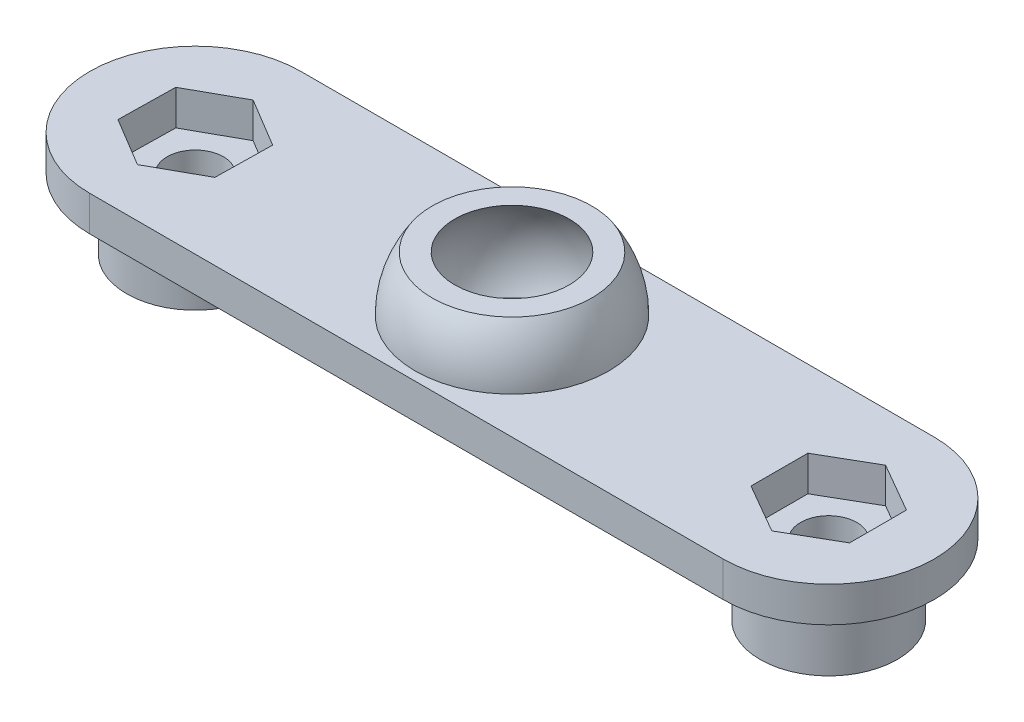
ISO-10303-21;
HEADER;
FILE_DESCRIPTION(('STEP AP214'),'2;1');
FILE_NAME('part.step','',(''),(''),'','','');
FILE_SCHEMA(('AUTOMOTIVE_DESIGN { 1 0 10303 214 1 1 1 1 }'));
ENDSEC;
DATA;
#1=APPLICATION_CONTEXT('core data for automotive mechanical design processes');
#2=APPLICATION_PROTOCOL_DEFINITION('international standard','automotive_design',2000,#1);
#3=PRODUCT_CONTEXT('',#1,'mechanical');
#4=PRODUCT('Part','Part','',(#3));
#5=PRODUCT_RELATED_PRODUCT_CATEGORY('part','',(#4));
#6=PRODUCT_DEFINITION_FORMATION('','',#4);
#7=PRODUCT_DEFINITION_CONTEXT('part definition',#1,'design');
#8=PRODUCT_DEFINITION('design','',#6,#7);
#9=PRODUCT_DEFINITION_SHAPE('','',#8);
#10=(LENGTH_UNIT() NAMED_UNIT(*) SI_UNIT(.MILLI.,.METRE.));
#11=(NAMED_UNIT(*) PLANE_ANGLE_UNIT() SI_UNIT($,.RADIAN.));
#12=(NAMED_UNIT(*) SI_UNIT($,.STERADIAN.) SOLID_ANGLE_UNIT());
#13=UNCERTAINTY_MEASURE_WITH_UNIT(LENGTH_MEASURE(1.E-05),#10,'distance_accuracy_value','');
#14=(GEOMETRIC_REPRESENTATION_CONTEXT(3) GLOBAL_UNCERTAINTY_ASSIGNED_CONTEXT((#13)) GLOBAL_UNIT_ASSIGNED_CONTEXT((#10,
#11,#12)) REPRESENTATION_CONTEXT('',''));
#15=CARTESIAN_POINT('',(0.,0.,0.));
#16=DIRECTION('',(0.,0.,1.));
#17=DIRECTION('',(1.,0.,0.));
#18=AXIS2_PLACEMENT_3D('',#15,#16,#17);
#19=CARTESIAN_POINT('',(18.,2.,0.));
#20=DIRECTION('',(0.,-1.,0.));
#21=DIRECTION('',(0.,0.,-1.));
#22=AXIS2_PLACEMENT_3D('',#19,#20,#21);
#23=CYLINDRICAL_SURFACE('',#22,1.6);
#24=CARTESIAN_POINT('',(18.,-4.,0.));
#25=DIRECTION('',(0.,-1.,0.));
#26=DIRECTION('',(0.,0.,-1.));
#27=AXIS2_PLACEMENT_3D('',#24,#25,#26);
#28=CIRCLE('',#27,1.6);
#29=CARTESIAN_POINT('',(18.,-4.,-1.6));
#30=VERTEX_POINT('',#29);
#31=EDGE_CURVE('E257',#30,#30,#28,.T.);
#32=ORIENTED_EDGE('',*,*,#31,.T.);
#33=EDGE_LOOP('',(#32));
#34=FACE_BOUND('',#33,.T.);
#35=CARTESIAN_POINT('',(18.,0.,0.));
#36=DIRECTION('',(0.,1.,0.));
#37=DIRECTION('',(0.,0.,1.));
#38=AXIS2_PLACEMENT_3D('',#35,#36,#37);
#39=CIRCLE('',#38,1.6);
#40=CARTESIAN_POINT('',(18.,0.,1.6));
#41=VERTEX_POINT('',#40);
#42=EDGE_CURVE('E36',#41,#41,#39,.T.);
#43=ORIENTED_EDGE('',*,*,#42,.T.);
#44=EDGE_LOOP('',(#43));
#45=FACE_BOUND('',#44,.T.);
#46=ADVANCED_FACE('F32',(#34,#45),#23,.F.);
#47=CARTESIAN_POINT('',(-18.,2.,0.));
#48=DIRECTION('',(0.,-1.,0.));
#49=DIRECTION('',(0.,0.,-1.));
#50=AXIS2_PLACEMENT_3D('',#47,#48,#49);
#51=CYLINDRICAL_SURFACE('',#50,1.6);
#52=CARTESIAN_POINT('',(-18.,-4.,0.));
#53=DIRECTION('',(0.,-1.,0.));
#54=DIRECTION('',(0.,0.,-1.));
#55=AXIS2_PLACEMENT_3D('',#52,#53,#54);
#56=CIRCLE('',#55,1.6);
#57=CARTESIAN_POINT('',(-18.,-4.,-1.6));
#58=VERTEX_POINT('',#57);
#59=EDGE_CURVE('E263',#58,#58,#56,.T.);
#60=ORIENTED_EDGE('',*,*,#59,.T.);
#61=EDGE_LOOP('',(#60));
#62=FACE_BOUND('',#61,.T.);
#63=CARTESIAN_POINT('',(-18.,0.,0.));
#64=DIRECTION('',(0.,1.,0.));
#65=DIRECTION('',(0.,0.,1.));
#66=AXIS2_PLACEMENT_3D('',#63,#64,#65);
#67=CIRCLE('',#66,1.6);
#68=CARTESIAN_POINT('',(-18.,0.,1.6));
#69=VERTEX_POINT('',#68);
#70=EDGE_CURVE('E238',#69,#69,#67,.T.);
#71=ORIENTED_EDGE('',*,*,#70,.T.);
#72=EDGE_LOOP('',(#71));
#73=FACE_BOUND('',#72,.T.);
#74=ADVANCED_FACE('F306',(#62,#73),#51,.F.);
#75=CARTESIAN_POINT('',(-18.,0.,0.));
#76=DIRECTION('',(0.,1.,0.));
#77=DIRECTION('',(0.,0.,1.));
#78=AXIS2_PLACEMENT_3D('',#75,#76,#77);
#79=PLANE('',#78);
#80=CARTESIAN_POINT('',(-18.,0.,0.));
#81=DIRECTION('',(0.,1.,0.));
#82=DIRECTION('',(0.,0.,1.));
#83=AXIS2_PLACEMENT_3D('',#80,#81,#82);
#84=CIRCLE('',#83,3.9);
#85=CARTESIAN_POINT('',(-18.,0.,3.9));
#86=VERTEX_POINT('',#85);
#87=EDGE_CURVE('E299',#86,#86,#84,.F.);
#88=ORIENTED_EDGE('',*,*,#87,.F.);
#89=EDGE_LOOP('',(#88));
#90=FACE_BOUND('',#89,.T.);
#91=CARTESIAN_POINT('',(-18.,0.,0.));
#92=DIRECTION('',(0.,1.,0.));
#93=DIRECTION('',(0.,0.,1.));
#94=AXIS2_PLACEMENT_3D('',#91,#92,#93);
#95=CIRCLE('',#94,6.);
#96=CARTESIAN_POINT('',(-18.,0.,-6.));
#97=VERTEX_POINT('',#96);
#98=CARTESIAN_POINT('',(-18.,0.,6.));
#99=VERTEX_POINT('',#98);
#100=EDGE_CURVE('E269',#97,#99,#95,.T.);
#101=ORIENTED_EDGE('',*,*,#100,.F.);
#102=DIRECTION('',(-1.,0.,0.));
#103=VECTOR('',#102,1.);
#104=CARTESIAN_POINT('',(-18.,0.,-6.));
#105=LINE('',#104,#103);
#106=CARTESIAN_POINT('',(18.,0.,-6.));
#107=VERTEX_POINT('',#106);
#108=EDGE_CURVE('E274',#107,#97,#105,.T.);
#109=ORIENTED_EDGE('',*,*,#108,.F.);
#110=CARTESIAN_POINT('',(18.,0.,0.));
#111=DIRECTION('',(0.,1.,0.));
#112=DIRECTION('',(0.,0.,1.));
#113=AXIS2_PLACEMENT_3D('',#110,#111,#112);
#114=CIRCLE('',#113,6.);
#115=CARTESIAN_POINT('',(18.,0.,6.));
#116=VERTEX_POINT('',#115);
#117=EDGE_CURVE('E285',#116,#107,#114,.T.);
#118=ORIENTED_EDGE('',*,*,#117,.F.);
#119=DIRECTION('',(1.,0.,0.));
#120=VECTOR('',#119,1.);
#121=CARTESIAN_POINT('',(-18.,0.,6.));
#122=LINE('',#121,#120);
#123=EDGE_CURVE('E283',#99,#116,#122,.T.);
#124=ORIENTED_EDGE('',*,*,#123,.F.);
#125=EDGE_LOOP('',(#101,#109,#118,#124));
#126=FACE_BOUND('',#125,.T.);
#127=CARTESIAN_POINT('',(18.,0.,0.));
#128=DIRECTION('',(0.,1.,0.));
#129=DIRECTION('',(0.,0.,1.));
#130=AXIS2_PLACEMENT_3D('',#127,#128,#129);
#131=CIRCLE('',#130,3.9);
#132=CARTESIAN_POINT('',(18.,0.,3.9));
#133=VERTEX_POINT('',#132);
#134=EDGE_CURVE('E41',#133,#133,#131,.F.);
#135=ORIENTED_EDGE('',*,*,#134,.F.);
#136=EDGE_LOOP('',(#135));
#137=FACE_BOUND('',#136,.T.);
#138=CARTESIAN_POINT('',(0.,0.,0.));
#139=DIRECTION('',(0.,1.,0.));
#140=DIRECTION('',(0.,0.,1.));
#141=AXIS2_PLACEMENT_3D('',#138,#139,#140);
#142=CIRCLE('',#141,4.03112887414927);
#143=CARTESIAN_POINT('',(0.,0.,4.03112887414927));
#144=VERTEX_POINT('',#143);
#145=EDGE_CURVE('E248',#144,#144,#142,.T.);
#146=ORIENTED_EDGE('',*,*,#145,.T.);
#147=EDGE_LOOP('',(#146));
#148=FACE_BOUND('',#147,.T.);
#149=ADVANCED_FACE('F338',(#90,#126,#137,#148),#79,.F.);
#150=CARTESIAN_POINT('',(-18.,2.,0.));
#151=DIRECTION('',(0.,1.,0.));
#152=DIRECTION('',(0.,0.,1.));
#153=AXIS2_PLACEMENT_3D('',#150,#151,#152);
#154=PLANE('',#153);
#155=DIRECTION('',(0.866025403784438,0.,0.5));
#156=VECTOR('',#155,1.);
#157=CARTESIAN_POINT('',(15.2,2.,1.61658075373095));
#158=LINE('',#157,#156);
#159=CARTESIAN_POINT('',(15.2,2.,1.61658075373095));
#160=VERTEX_POINT('',#159);
#161=CARTESIAN_POINT('',(18.,2.,3.2331615074619));
#162=VERTEX_POINT('',#161);
#163=EDGE_CURVE('E49',#160,#162,#158,.T.);
#164=ORIENTED_EDGE('',*,*,#163,.F.);
#165=DIRECTION('',(0.,0.,1.));
#166=VECTOR('',#165,1.);
#167=CARTESIAN_POINT('',(15.2,2.,-1.61658075373095));
#168=LINE('',#167,#166);
#169=CARTESIAN_POINT('',(15.2,2.,-1.61658075373095));
#170=VERTEX_POINT('',#169);
#171=EDGE_CURVE('E168',#170,#160,#168,.T.);
#172=ORIENTED_EDGE('',*,*,#171,.F.);
#173=DIRECTION('',(-0.866025403784439,0.,0.5));
#174=VECTOR('',#173,1.);
#175=CARTESIAN_POINT('',(18.,2.,-3.23316150746191));
#176=LINE('',#175,#174);
#177=CARTESIAN_POINT('',(18.,2.,-3.23316150746191));
#178=VERTEX_POINT('',#177);
#179=EDGE_CURVE('E171',#178,#170,#176,.T.);
#180=ORIENTED_EDGE('',*,*,#179,.F.);
#181=DIRECTION('',(-0.866025403784439,0.,-0.5));
#182=VECTOR('',#181,1.);
#183=CARTESIAN_POINT('',(20.8,2.,-1.61658075373095));
#184=LINE('',#183,#182);
#185=CARTESIAN_POINT('',(20.8,2.,-1.61658075373095));
#186=VERTEX_POINT('',#185);
#187=EDGE_CURVE('E187',#186,#178,#184,.T.);
#188=ORIENTED_EDGE('',*,*,#187,.F.);
#189=DIRECTION('',(0.,0.,-1.));
#190=VECTOR('',#189,1.);
#191=CARTESIAN_POINT('',(20.8,2.,1.61658075373095));
#192=LINE('',#191,#190);
#193=CARTESIAN_POINT('',(20.8,2.,1.61658075373095));
#194=VERTEX_POINT('',#193);
#195=EDGE_CURVE('E184',#194,#186,#192,.T.);
#196=ORIENTED_EDGE('',*,*,#195,.F.);
#197=DIRECTION('',(0.866025403784438,0.,-0.5));
#198=VECTOR('',#197,1.);
#199=CARTESIAN_POINT('',(18.,2.,3.2331615074619));
#200=LINE('',#199,#198);
#201=EDGE_CURVE('E182',#162,#194,#200,.T.);
#202=ORIENTED_EDGE('',*,*,#201,.F.);
#203=EDGE_LOOP('',(#164,#172,#180,#188,#196,#202));
#204=FACE_BOUND('',#203,.T.);
#205=DIRECTION('',(0.874174864633743,0.,-0.48561127050613));
#206=VECTOR('',#205,1.);
#207=CARTESIAN_POINT('',(-18.0534627041451,2.,3.23271945466953));
#208=LINE('',#207,#206);
#209=CARTESIAN_POINT('',(-18.0534627041451,2.,3.23271945466953));
#210=VERTEX_POINT('',#209);
#211=CARTESIAN_POINT('',(-15.2271141810206,2.,1.66265978727944));
#212=VERTEX_POINT('',#211);
#213=EDGE_CURVE('E57',#210,#212,#208,.T.);
#214=ORIENTED_EDGE('',*,*,#213,.F.);
#215=DIRECTION('',(0.857639128939217,0.,0.514252004869579));
#216=VECTOR('',#215,1.);
#217=CARTESIAN_POINT('',(-20.8263485231245,2.,1.57005966739009));
#218=LINE('',#217,#216);
#219=CARTESIAN_POINT('',(-20.8263485231245,2.,1.57005966739009));
#220=VERTEX_POINT('',#219);
#221=EDGE_CURVE('E205',#220,#210,#218,.T.);
#222=ORIENTED_EDGE('',*,*,#221,.F.);
#223=DIRECTION('',(-0.0165357356945256,0.,0.999863275375709));
#224=VECTOR('',#223,1.);
#225=CARTESIAN_POINT('',(-20.7728858189794,2.,-1.66265978727944));
#226=LINE('',#225,#224);
#227=CARTESIAN_POINT('',(-20.7728858189794,2.,-1.66265978727944));
#228=VERTEX_POINT('',#227);
#229=EDGE_CURVE('E231',#228,#220,#226,.T.);
#230=ORIENTED_EDGE('',*,*,#229,.F.);
#231=DIRECTION('',(-0.874174864633743,0.,0.48561127050613));
#232=VECTOR('',#231,1.);
#233=CARTESIAN_POINT('',(-17.9465372958549,2.,-3.23271945466953));
#234=LINE('',#233,#232);
#235=CARTESIAN_POINT('',(-17.9465372958549,2.,-3.23271945466953));
#236=VERTEX_POINT('',#235);
#237=EDGE_CURVE('E228',#236,#228,#234,.T.);
#238=ORIENTED_EDGE('',*,*,#237,.F.);
#239=DIRECTION('',(-0.857639128939217,0.,-0.514252004869579));
#240=VECTOR('',#239,1.);
#241=CARTESIAN_POINT('',(-15.1736514768755,2.,-1.57005966739009));
#242=LINE('',#241,#240);
#243=CARTESIAN_POINT('',(-15.1736514768755,2.,-1.57005966739009));
#244=VERTEX_POINT('',#243);
#245=EDGE_CURVE('E225',#244,#236,#242,.T.);
#246=ORIENTED_EDGE('',*,*,#245,.F.);
#247=DIRECTION('',(0.0165357356945256,0.,-0.999863275375709));
#248=VECTOR('',#247,1.);
#249=CARTESIAN_POINT('',(-15.2271141810206,2.,1.66265978727944));
#250=LINE('',#249,#248);
#251=EDGE_CURVE('E222',#212,#244,#250,.T.);
#252=ORIENTED_EDGE('',*,*,#251,.F.);
#253=EDGE_LOOP('',(#214,#222,#230,#238,#246,#252));
#254=FACE_BOUND('',#253,.T.);
#255=CARTESIAN_POINT('',(0.,2.,0.));
#256=DIRECTION('',(0.,1.,0.));
#257=DIRECTION('',(0.,0.,1.));
#258=AXIS2_PLACEMENT_3D('',#255,#256,#257);
#259=CIRCLE('',#258,5.5);
#260=CARTESIAN_POINT('',(0.,2.,5.5));
#261=VERTEX_POINT('',#260);
#262=EDGE_CURVE('E11',#261,#261,#259,.T.);
#263=ORIENTED_EDGE('',*,*,#262,.F.);
#264=EDGE_LOOP('',(#263));
#265=FACE_BOUND('',#264,.T.);
#266=CARTESIAN_POINT('',(-18.,2.,0.));
#267=DIRECTION('',(0.,1.,0.));
#268=DIRECTION('',(0.,0.,1.));
#269=AXIS2_PLACEMENT_3D('',#266,#267,#268);
#270=CIRCLE('',#269,6.);
#271=CARTESIAN_POINT('',(-18.,2.,-6.));
#272=VERTEX_POINT('',#271);
#273=CARTESIAN_POINT('',(-18.,2.,6.));
#274=VERTEX_POINT('',#273);
#275=EDGE_CURVE('E270',#272,#274,#270,.T.);
#276=ORIENTED_EDGE('',*,*,#275,.T.);
#277=DIRECTION('',(1.,0.,0.));
#278=VECTOR('',#277,1.);
#279=CARTESIAN_POINT('',(-18.,2.,6.));
#280=LINE('',#279,#278);
#281=CARTESIAN_POINT('',(18.,2.,6.));
#282=VERTEX_POINT('',#281);
#283=EDGE_CURVE('E273',#274,#282,#280,.T.);
#284=ORIENTED_EDGE('',*,*,#283,.T.);
#285=CARTESIAN_POINT('',(18.,2.,0.));
#286=DIRECTION('',(0.,1.,0.));
#287=DIRECTION('',(0.,0.,1.));
#288=AXIS2_PLACEMENT_3D('',#285,#286,#287);
#289=CIRCLE('',#288,6.);
#290=CARTESIAN_POINT('',(18.,2.,-6.));
#291=VERTEX_POINT('',#290);
#292=EDGE_CURVE('E276',#282,#291,#289,.T.);
#293=ORIENTED_EDGE('',*,*,#292,.T.);
#294=DIRECTION('',(-1.,0.,0.));
#295=VECTOR('',#294,1.);
#296=CARTESIAN_POINT('',(-18.,2.,-6.));
#297=LINE('',#296,#295);
#298=EDGE_CURVE('E278',#291,#272,#297,.T.);
#299=ORIENTED_EDGE('',*,*,#298,.T.);
#300=EDGE_LOOP('',(#276,#284,#293,#299));
#301=FACE_BOUND('',#300,.T.);
#302=ADVANCED_FACE('F335',(#204,#254,#265,#301),#154,.T.);
#303=CARTESIAN_POINT('',(-18.,2.,0.));
#304=DIRECTION('',(0.,-1.,0.));
#305=DIRECTION('',(0.,0.,-1.));
#306=AXIS2_PLACEMENT_3D('',#303,#304,#305);
#307=CYLINDRICAL_SURFACE('',#306,6.);
#308=ORIENTED_EDGE('',*,*,#100,.T.);
#309=DIRECTION('',(0.,-1.,0.));
#310=VECTOR('',#309,1.);
#311=CARTESIAN_POINT('',(-18.,2.,6.));
#312=LINE('',#311,#310);
#313=EDGE_CURVE('E296',#274,#99,#312,.T.);
#314=ORIENTED_EDGE('',*,*,#313,.F.);
#315=ORIENTED_EDGE('',*,*,#275,.F.);
#316=DIRECTION('',(0.,-1.,0.));
#317=VECTOR('',#316,1.);
#318=CARTESIAN_POINT('',(-18.,2.,-6.));
#319=LINE('',#318,#317);
#320=EDGE_CURVE('E280',#272,#97,#319,.T.);
#321=ORIENTED_EDGE('',*,*,#320,.T.);
#322=EDGE_LOOP('',(#308,#314,#315,#321));
#323=FACE_BOUND('',#322,.T.);
#324=ADVANCED_FACE('F34',(#323),#307,.T.);
#325=CARTESIAN_POINT('',(-18.,2.,6.));
#326=DIRECTION('',(0.,0.,-1.));
#327=DIRECTION('',(-1.,0.,0.));
#328=AXIS2_PLACEMENT_3D('',#325,#326,#327);
#329=PLANE('',#328);
#330=ORIENTED_EDGE('',*,*,#123,.T.);
#331=DIRECTION('',(0.,-1.,0.));
#332=VECTOR('',#331,1.);
#333=CARTESIAN_POINT('',(18.,2.,6.));
#334=LINE('',#333,#332);
#335=EDGE_CURVE('E293',#282,#116,#334,.T.);
#336=ORIENTED_EDGE('',*,*,#335,.F.);
#337=ORIENTED_EDGE('',*,*,#283,.F.);
#338=ORIENTED_EDGE('',*,*,#313,.T.);
#339=EDGE_LOOP('',(#330,#336,#337,#338));
#340=FACE_BOUND('',#339,.T.);
#341=ADVANCED_FACE('F351',(#340),#329,.F.);
#342=CARTESIAN_POINT('',(18.,2.,0.));
#343=DIRECTION('',(0.,-1.,0.));
#344=DIRECTION('',(0.,0.,-1.));
#345=AXIS2_PLACEMENT_3D('',#342,#343,#344);
#346=CYLINDRICAL_SURFACE('',#345,6.);
#347=ORIENTED_EDGE('',*,*,#117,.T.);
#348=DIRECTION('',(0.,-1.,0.));
#349=VECTOR('',#348,1.);
#350=CARTESIAN_POINT('',(18.,2.,-6.));
#351=LINE('',#350,#349);
#352=EDGE_CURVE('E290',#291,#107,#351,.T.);
#353=ORIENTED_EDGE('',*,*,#352,.F.);
#354=ORIENTED_EDGE('',*,*,#292,.F.);
#355=ORIENTED_EDGE('',*,*,#335,.T.);
#356=EDGE_LOOP('',(#347,#353,#354,#355));
#357=FACE_BOUND('',#356,.T.);
#358=ADVANCED_FACE('F356',(#357),#346,.T.);
#359=CARTESIAN_POINT('',(-18.,2.,-6.));
#360=DIRECTION('',(0.,0.,1.));
#361=DIRECTION('',(1.,0.,0.));
#362=AXIS2_PLACEMENT_3D('',#359,#360,#361);
#363=PLANE('',#362);
#364=ORIENTED_EDGE('',*,*,#108,.T.);
#365=ORIENTED_EDGE('',*,*,#320,.F.);
#366=ORIENTED_EDGE('',*,*,#298,.F.);
#367=ORIENTED_EDGE('',*,*,#352,.T.);
#368=EDGE_LOOP('',(#364,#365,#366,#367));
#369=FACE_BOUND('',#368,.T.);
#370=ADVANCED_FACE('F359',(#369),#363,.F.);
#371=CARTESIAN_POINT('',(-18.,-4.,0.));
#372=DIRECTION('',(0.,-1.,0.));
#373=DIRECTION('',(0.,0.,-1.));
#374=AXIS2_PLACEMENT_3D('',#371,#372,#373);
#375=PLANE('',#374);
#376=CARTESIAN_POINT('',(-18.,-4.,0.));
#377=DIRECTION('',(0.,-1.,0.));
#378=DIRECTION('',(0.,0.,-1.));
#379=AXIS2_PLACEMENT_3D('',#376,#377,#378);
#380=CIRCLE('',#379,3.9);
#381=CARTESIAN_POINT('',(-18.,-4.,-3.9));
#382=VERTEX_POINT('',#381);
#383=EDGE_CURVE('E266',#382,#382,#380,.T.);
#384=ORIENTED_EDGE('',*,*,#383,.T.);
#385=EDGE_LOOP('',(#384));
#386=FACE_BOUND('',#385,.T.);
#387=ORIENTED_EDGE('',*,*,#59,.F.);
#388=EDGE_LOOP('',(#387));
#389=FACE_BOUND('',#388,.T.);
#390=ADVANCED_FACE('F399',(#386,#389),#375,.T.);
#391=CARTESIAN_POINT('',(-18.,-4.,0.));
#392=DIRECTION('',(0.,1.,0.));
#393=DIRECTION('',(0.,0.,1.));
#394=AXIS2_PLACEMENT_3D('',#391,#392,#393);
#395=CYLINDRICAL_SURFACE('',#394,3.9);
#396=ORIENTED_EDGE('',*,*,#383,.F.);
#397=EDGE_LOOP('',(#396));
#398=FACE_BOUND('',#397,.T.);
#399=ORIENTED_EDGE('',*,*,#87,.T.);
#400=EDGE_LOOP('',(#399));
#401=FACE_BOUND('',#400,.T.);
#402=ADVANCED_FACE('F460',(#398,#401),#395,.T.);
#403=CARTESIAN_POINT('',(18.,-4.,0.));
#404=DIRECTION('',(0.,-1.,0.));
#405=DIRECTION('',(0.,0.,-1.));
#406=AXIS2_PLACEMENT_3D('',#403,#404,#405);
#407=PLANE('',#406);
#408=CARTESIAN_POINT('',(18.,-4.,0.));
#409=DIRECTION('',(0.,-1.,0.));
#410=DIRECTION('',(0.,0.,-1.));
#411=AXIS2_PLACEMENT_3D('',#408,#409,#410);
#412=CIRCLE('',#411,3.9);
#413=CARTESIAN_POINT('',(18.,-4.,-3.9));
#414=VERTEX_POINT('',#413);
#415=EDGE_CURVE('E260',#414,#414,#412,.T.);
#416=ORIENTED_EDGE('',*,*,#415,.T.);
#417=EDGE_LOOP('',(#416));
#418=FACE_BOUND('',#417,.T.);
#419=ORIENTED_EDGE('',*,*,#31,.F.);
#420=EDGE_LOOP('',(#419));
#421=FACE_BOUND('',#420,.T.);
#422=ADVANCED_FACE('F452',(#418,#421),#407,.T.);
#423=CARTESIAN_POINT('',(18.,-4.,0.));
#424=DIRECTION('',(0.,1.,0.));
#425=DIRECTION('',(0.,0.,1.));
#426=AXIS2_PLACEMENT_3D('',#423,#424,#425);
#427=CYLINDRICAL_SURFACE('',#426,3.9);
#428=ORIENTED_EDGE('',*,*,#415,.F.);
#429=EDGE_LOOP('',(#428));
#430=FACE_BOUND('',#429,.T.);
#431=ORIENTED_EDGE('',*,*,#134,.T.);
#432=EDGE_LOOP('',(#431));
#433=FACE_BOUND('',#432,.T.);
#434=ADVANCED_FACE('F373',(#430,#433),#427,.T.);
#435=CARTESIAN_POINT('',(0.,2.,0.));
#436=DIRECTION('',(0.,1.,0.));
#437=DIRECTION('',(0.,0.,1.));
#438=AXIS2_PLACEMENT_3D('',#435,#436,#437);
#439=SPHERICAL_SURFACE('',#438,4.5);
#440=CARTESIAN_POINT('',(0.,5.11247489949718,0.));
#441=DIRECTION('',(0.,1.,0.));
#442=DIRECTION('',(0.,0.,1.));
#443=AXIS2_PLACEMENT_3D('',#440,#441,#442);
#444=CIRCLE('',#443,3.25);
#445=CARTESIAN_POINT('',(0.,5.11247489949718,3.25));
#446=VERTEX_POINT('',#445);
#447=EDGE_CURVE('E254',#446,#446,#444,.T.);
#448=CARTESIAN_POINT('',(0.,0.,4.03112887414927));
#449=CARTESIAN_POINT('',(0.,0.0514109533866477,4.05663649381619));
#450=CARTESIAN_POINT('',(0.,0.103310334893777,4.08115956909441));
#451=CARTESIAN_POINT('',(0.,0.208008950353198,4.12820304834484));
#452=CARTESIAN_POINT('',(0.,0.260808184305488,4.15072345231704));
#453=CARTESIAN_POINT('',(0.,0.367229500859427,4.19372800642679));
#454=CARTESIAN_POINT('',(0.,0.420851583461076,4.21421215656433));
#455=CARTESIAN_POINT('',(0.,0.528840036196824,4.25311438637794));
#456=CARTESIAN_POINT('',(0.,0.583206406330924,4.271532466054));
#457=CARTESIAN_POINT('',(0.,0.692603878166884,4.30627555196273));
#458=CARTESIAN_POINT('',(0.,0.747634979868744,4.32260055819541));
#459=CARTESIAN_POINT('',(0.,0.858281360570793,4.3531336142551));
#460=CARTESIAN_POINT('',(0.,0.913896639570982,4.36734166408211));
#461=CARTESIAN_POINT('',(0.,1.02562997233052,4.39362000784284));
#462=CARTESIAN_POINT('',(0.,1.08174802608987,4.40569030177656));
#463=CARTESIAN_POINT('',(0.,1.19440476809893,4.42767546734095));
#464=CARTESIAN_POINT('',(0.,1.25094345634864,4.43759033897162));
#465=CARTESIAN_POINT('',(0.,1.36435871187518,4.45525014732264));
#466=CARTESIAN_POINT('',(0.,1.42123527915201,4.46299508404299));
#467=CARTESIAN_POINT('',(0.,1.53524304258612,4.47630368638624));
#468=CARTESIAN_POINT('',(0.,1.59237423874339,4.48186735200913));
#469=CARTESIAN_POINT('',(0.,1.70680763712686,4.49080526861463));
#470=CARTESIAN_POINT('',(0.,1.76410983935307,4.49417951959723));
#471=CARTESIAN_POINT('',(0.,1.87880137675231,4.49873366804206));
#472=CARTESIAN_POINT('',(0.,1.93619071192535,4.49991356550429));
#473=CARTESIAN_POINT('',(0.,2.05097251456232,4.5000772798936));
#474=CARTESIAN_POINT('',(0.,2.10836498202626,4.49906109682069));
#475=CARTESIAN_POINT('',(0.,2.22306904400371,4.49483413752519));
#476=CARTESIAN_POINT('',(0.,2.28038063851723,4.49162336130261));
#477=CARTESIAN_POINT('',(0.,2.39483906772627,4.48301191531451));
#478=CARTESIAN_POINT('',(0.,2.4519859024218,4.47761124554898));
#479=CARTESIAN_POINT('',(0.,2.56603116628587,4.46462791742467));
#480=CARTESIAN_POINT('',(0.,2.62292959545442,4.45704525906589));
#481=CARTESIAN_POINT('',(0.,2.73639476614622,4.43970905247711));
#482=CARTESIAN_POINT('',(0.,2.79296150766948,4.42995550424711));
#483=CARTESIAN_POINT('',(0.,2.90568050644295,4.40829179416517));
#484=CARTESIAN_POINT('',(0.,2.96183276369317,4.39638163231323));
#485=CARTESIAN_POINT('',(0.,3.07364060397261,4.37042212786774));
#486=CARTESIAN_POINT('',(0.,3.12929618700183,4.3563727852742));
#487=CARTESIAN_POINT('',(0.,3.24002921587246,4.32615548334056));
#488=CARTESIAN_POINT('',(0.,3.29510666171388,4.30998752400047));
#489=CARTESIAN_POINT('',(0.,3.40460279946006,4.27555665358361));
#490=CARTESIAN_POINT('',(0.,3.45902149136483,4.25729374250683));
#491=CARTESIAN_POINT('',(0.,3.56712046870681,4.21869970000442));
#492=CARTESIAN_POINT('',(0.,3.62080075414402,4.19836856857878));
#493=CARTESIAN_POINT('',(0.,3.72734434681998,4.15566784401189));
#494=CARTESIAN_POINT('',(0.,3.78020765405873,4.13329825087065));
#495=CARTESIAN_POINT('',(0.,3.88503991443144,4.08655334521531));
#496=CARTESIAN_POINT('',(0.,3.9370088675654,4.06217803270123));
#497=CARTESIAN_POINT('',(0.,4.03997635282985,4.01145736634657));
#498=CARTESIAN_POINT('',(0.,4.09097488496035,3.98511201250601));
#499=CARTESIAN_POINT('',(0.,4.19192688193398,3.93048982532878));
#500=CARTESIAN_POINT('',(0.,4.24188034677712,3.90221299199211));
#501=CARTESIAN_POINT('',(0.,4.34066909176588,3.84376923386597));
#502=CARTESIAN_POINT('',(0.,4.3895043719115,3.81360230907649));
#503=CARTESIAN_POINT('',(0.,4.48598526972504,3.75142252593197));
#504=CARTESIAN_POINT('',(0.,4.53363088739295,3.71940966757691));
#505=CARTESIAN_POINT('',(0.,4.6276627127858,3.65358486468431));
#506=CARTESIAN_POINT('',(0.,4.67404892051073,3.61977292014675));
#507=CARTESIAN_POINT('',(0.,4.7654940629697,3.55039947184417));
#508=CARTESIAN_POINT('',(0.,4.81055299770373,3.51483796807914));
#509=CARTESIAN_POINT('',(0.,4.89927752076552,3.44201731648422));
#510=CARTESIAN_POINT('',(0.,4.94294310909328,3.40475816865431));
#511=CARTESIAN_POINT('',(0.,5.02881747672123,3.32859727315272));
#512=CARTESIAN_POINT('',(0.,5.07102625602142,3.28969552548103));
#513=CARTESIAN_POINT('',(0.,5.11247489949718,3.25));
#514=B_SPLINE_CURVE_WITH_KNOTS('',3,(#448,#449,#450,#451,#452,#453,#454,#455,#456,#457,#458,
#459,#460,#461,#462,#463,#464,#465,#466,#467,#468,#469,#470,#471,#472,#473,#474,#475,#476,#477,
#478,#479,#480,#481,#482,#483,#484,#485,#486,#487,#488,#489,#490,#491,#492,#493,#494,#495,#496,
#497,#498,#499,#500,#501,#502,#503,#504,#505,#506,#507,#508,#509,#510,#511,#512,#513),
.UNSPECIFIED.,.F.,.F.,(4,2,2,2,2,2,2,2,2,2,2,2,2,2,2,2,2,2,2,2,2,2,2,2,2,2,2,2,2,2,2,2,4),(0.,
0.172162379667854,0.344324759335707,0.51648713900356,0.688649518671413,0.860811898339267,
1.03297427800712,1.20513665767497,1.37729903734283,1.54946141701068,1.72162379667853,
1.89378617634639,2.06594855601424,2.23811093568209,2.41027331534995,2.5824356950178,
2.75459807468565,2.92676045435351,3.09892283402136,3.27108521368921,3.44324759335707,
3.61540997302492,3.78757235269277,3.95973473236063,4.13189711202848,4.30405949169633,
4.47622187136419,4.64838425103204,4.82054663069989,4.99270901036775,5.1648713900356,
5.33703376970345,5.50919614937131),.UNSPECIFIED.);
#515=EDGE_CURVE('BSEAM369',#144,#446,#514,.T.);
#516=ORIENTED_EDGE('',*,*,#145,.F.);
#517=ORIENTED_EDGE('',*,*,#447,.T.);
#518=ORIENTED_EDGE('',*,*,#515,.T.);
#519=ORIENTED_EDGE('',*,*,#515,.F.);
#520=EDGE_LOOP('',(#516,#518,#517,#519));
#521=FACE_BOUND('',#520,.T.);
#522=ADVANCED_FACE('F369',(#521),#439,.F.);
#523=CARTESIAN_POINT('',(0.,5.11247489949718,3.25));
#524=DIRECTION('',(0.,1.,0.));
#525=DIRECTION('',(0.,0.,1.));
#526=AXIS2_PLACEMENT_3D('',#523,#524,#525);
#527=PLANE('',#526);
#528=CARTESIAN_POINT('',(0.,5.11247489949718,0.));
#529=DIRECTION('',(0.,1.,0.));
#530=DIRECTION('',(0.,0.,1.));
#531=AXIS2_PLACEMENT_3D('',#528,#529,#530);
#532=CIRCLE('',#531,4.53458928680426);
#533=CARTESIAN_POINT('',(0.,5.11247489949718,4.53458928680426));
#534=VERTEX_POINT('',#533);
#535=EDGE_CURVE('E251',#534,#534,#532,.T.);
#536=ORIENTED_EDGE('',*,*,#535,.T.);
#537=EDGE_LOOP('',(#536));
#538=FACE_BOUND('',#537,.T.);
#539=ORIENTED_EDGE('',*,*,#447,.F.);
#540=EDGE_LOOP('',(#539));
#541=FACE_BOUND('',#540,.T.);
#542=ADVANCED_FACE('F372',(#538,#541),#527,.T.);
#543=CARTESIAN_POINT('',(0.,2.,0.));
#544=DIRECTION('',(0.,1.,0.));
#545=DIRECTION('',(0.,0.,1.));
#546=AXIS2_PLACEMENT_3D('',#543,#544,#545);
#547=SPHERICAL_SURFACE('',#546,5.5);
#548=ORIENTED_EDGE('',*,*,#262,.T.);
#549=EDGE_LOOP('',(#548));
#550=FACE_BOUND('',#549,.T.);
#551=ORIENTED_EDGE('',*,*,#535,.F.);
#552=EDGE_LOOP('',(#551));
#553=FACE_BOUND('',#552,.T.);
#554=ADVANCED_FACE('F378',(#550,#553),#547,.T.);
#555=CARTESIAN_POINT('',(-18.0534627041451,0.,3.23271945466953));
#556=DIRECTION('',(0.48561127050613,0.,0.874174864633743));
#557=DIRECTION('',(0.874174864633743,0.,-0.48561127050613));
#558=AXIS2_PLACEMENT_3D('',#555,#556,#557);
#559=PLANE('',#558);
#560=ORIENTED_EDGE('',*,*,#213,.T.);
#561=DIRECTION('',(0.,1.,0.));
#562=VECTOR('',#561,1.);
#563=CARTESIAN_POINT('',(-15.2271141810206,0.,1.66265978727944));
#564=LINE('',#563,#562);
#565=CARTESIAN_POINT('',(-15.2271141810206,0.,1.66265978727944));
#566=VERTEX_POINT('',#565);
#567=EDGE_CURVE('E220',#566,#212,#564,.T.);
#568=ORIENTED_EDGE('',*,*,#567,.F.);
#569=DIRECTION('',(0.874174864633743,0.,-0.48561127050613));
#570=VECTOR('',#569,1.);
#571=CARTESIAN_POINT('',(-18.0534627041451,0.,3.23271945466953));
#572=LINE('',#571,#570);
#573=CARTESIAN_POINT('',(-18.0534627041451,0.,3.23271945466953));
#574=VERTEX_POINT('',#573);
#575=EDGE_CURVE('E201',#574,#566,#572,.T.);
#576=ORIENTED_EDGE('',*,*,#575,.F.);
#577=DIRECTION('',(0.,1.,0.));
#578=VECTOR('',#577,1.);
#579=CARTESIAN_POINT('',(-18.0534627041451,0.,3.23271945466953));
#580=LINE('',#579,#578);
#581=EDGE_CURVE('E236',#574,#210,#580,.T.);
#582=ORIENTED_EDGE('',*,*,#581,.T.);
#583=EDGE_LOOP('',(#560,#568,#576,#582));
#584=FACE_BOUND('',#583,.T.);
#585=ADVANCED_FACE('F316',(#584),#559,.F.);
#586=CARTESIAN_POINT('',(-20.8263485231245,0.,1.57005966739009));
#587=DIRECTION('',(-0.514252004869579,0.,0.857639128939217));
#588=DIRECTION('',(0.857639128939217,0.,0.514252004869579));
#589=AXIS2_PLACEMENT_3D('',#586,#587,#588);
#590=PLANE('',#589);
#591=ORIENTED_EDGE('',*,*,#221,.T.);
#592=ORIENTED_EDGE('',*,*,#581,.F.);
#593=DIRECTION('',(0.857639128939217,0.,0.514252004869579));
#594=VECTOR('',#593,1.);
#595=CARTESIAN_POINT('',(-20.8263485231245,0.,1.57005966739009));
#596=LINE('',#595,#594);
#597=CARTESIAN_POINT('',(-20.8263485231245,0.,1.57005966739009));
#598=VERTEX_POINT('',#597);
#599=EDGE_CURVE('E217',#598,#574,#596,.T.);
#600=ORIENTED_EDGE('',*,*,#599,.F.);
#601=DIRECTION('',(0.,1.,0.));
#602=VECTOR('',#601,1.);
#603=CARTESIAN_POINT('',(-20.8263485231245,0.,1.57005966739009));
#604=LINE('',#603,#602);
#605=EDGE_CURVE('E239',#598,#220,#604,.T.);
#606=ORIENTED_EDGE('',*,*,#605,.T.);
#607=EDGE_LOOP('',(#591,#592,#600,#606));
#608=FACE_BOUND('',#607,.T.);
#609=ADVANCED_FACE('F333',(#608),#590,.F.);
#610=CARTESIAN_POINT('',(-20.7728858189794,0.,-1.66265978727944));
#611=DIRECTION('',(-0.999863275375709,0.,-0.0165357356945256));
#612=DIRECTION('',(-0.0165357356945256,0.,0.999863275375709));
#613=AXIS2_PLACEMENT_3D('',#610,#611,#612);
#614=PLANE('',#613);
#615=ORIENTED_EDGE('',*,*,#229,.T.);
#616=ORIENTED_EDGE('',*,*,#605,.F.);
#617=DIRECTION('',(-0.0165357356945256,0.,0.999863275375709));
#618=VECTOR('',#617,1.);
#619=CARTESIAN_POINT('',(-20.7728858189794,0.,-1.66265978727944));
#620=LINE('',#619,#618);
#621=CARTESIAN_POINT('',(-20.7728858189794,0.,-1.66265978727944));
#622=VERTEX_POINT('',#621);
#623=EDGE_CURVE('E214',#622,#598,#620,.T.);
#624=ORIENTED_EDGE('',*,*,#623,.F.);
#625=DIRECTION('',(0.,1.,0.));
#626=VECTOR('',#625,1.);
#627=CARTESIAN_POINT('',(-20.7728858189794,0.,-1.66265978727944));
#628=LINE('',#627,#626);
#629=EDGE_CURVE('E241',#622,#228,#628,.T.);
#630=ORIENTED_EDGE('',*,*,#629,.T.);
#631=EDGE_LOOP('',(#615,#616,#624,#630));
#632=FACE_BOUND('',#631,.T.);
#633=ADVANCED_FACE('F330',(#632),#614,.F.);
#634=CARTESIAN_POINT('',(-17.9465372958549,0.,-3.23271945466953));
#635=DIRECTION('',(-0.48561127050613,0.,-0.874174864633743));
#636=DIRECTION('',(-0.874174864633743,0.,0.48561127050613));
#637=AXIS2_PLACEMENT_3D('',#634,#635,#636);
#638=PLANE('',#637);
#639=ORIENTED_EDGE('',*,*,#237,.T.);
#640=ORIENTED_EDGE('',*,*,#629,.F.);
#641=DIRECTION('',(-0.874174864633743,0.,0.48561127050613));
#642=VECTOR('',#641,1.);
#643=CARTESIAN_POINT('',(-17.9465372958549,0.,-3.23271945466953));
#644=LINE('',#643,#642);
#645=CARTESIAN_POINT('',(-17.9465372958549,0.,-3.23271945466953));
#646=VERTEX_POINT('',#645);
#647=EDGE_CURVE('E211',#646,#622,#644,.T.);
#648=ORIENTED_EDGE('',*,*,#647,.F.);
#649=DIRECTION('',(0.,1.,0.));
#650=VECTOR('',#649,1.);
#651=CARTESIAN_POINT('',(-17.9465372958549,0.,-3.23271945466953));
#652=LINE('',#651,#650);
#653=EDGE_CURVE('E243',#646,#236,#652,.T.);
#654=ORIENTED_EDGE('',*,*,#653,.T.);
#655=EDGE_LOOP('',(#639,#640,#648,#654));
#656=FACE_BOUND('',#655,.T.);
#657=ADVANCED_FACE('F326',(#656),#638,.F.);
#658=CARTESIAN_POINT('',(-15.1736514768755,0.,-1.57005966739009));
#659=DIRECTION('',(0.514252004869579,0.,-0.857639128939217));
#660=DIRECTION('',(-0.857639128939217,0.,-0.514252004869579));
#661=AXIS2_PLACEMENT_3D('',#658,#659,#660);
#662=PLANE('',#661);
#663=ORIENTED_EDGE('',*,*,#245,.T.);
#664=ORIENTED_EDGE('',*,*,#653,.F.);
#665=DIRECTION('',(-0.857639128939217,0.,-0.514252004869579));
#666=VECTOR('',#665,1.);
#667=CARTESIAN_POINT('',(-15.1736514768755,0.,-1.57005966739009));
#668=LINE('',#667,#666);
#669=CARTESIAN_POINT('',(-15.1736514768755,0.,-1.57005966739009));
#670=VERTEX_POINT('',#669);
#671=EDGE_CURVE('E208',#670,#646,#668,.T.);
#672=ORIENTED_EDGE('',*,*,#671,.F.);
#673=DIRECTION('',(0.,1.,0.));
#674=VECTOR('',#673,1.);
#675=CARTESIAN_POINT('',(-15.1736514768755,0.,-1.57005966739009));
#676=LINE('',#675,#674);
#677=EDGE_CURVE('E245',#670,#244,#676,.T.);
#678=ORIENTED_EDGE('',*,*,#677,.T.);
#679=EDGE_LOOP('',(#663,#664,#672,#678));
#680=FACE_BOUND('',#679,.T.);
#681=ADVANCED_FACE('F322',(#680),#662,.F.);
#682=CARTESIAN_POINT('',(-15.2271141810206,0.,1.66265978727944));
#683=DIRECTION('',(0.999863275375709,0.,0.0165357356945256));
#684=DIRECTION('',(0.0165357356945256,0.,-0.999863275375709));
#685=AXIS2_PLACEMENT_3D('',#682,#683,#684);
#686=PLANE('',#685);
#687=ORIENTED_EDGE('',*,*,#251,.T.);
#688=ORIENTED_EDGE('',*,*,#677,.F.);
#689=DIRECTION('',(0.0165357356945256,0.,-0.999863275375709));
#690=VECTOR('',#689,1.);
#691=CARTESIAN_POINT('',(-15.2271141810206,0.,1.66265978727944));
#692=LINE('',#691,#690);
#693=EDGE_CURVE('E204',#566,#670,#692,.T.);
#694=ORIENTED_EDGE('',*,*,#693,.F.);
#695=ORIENTED_EDGE('',*,*,#567,.T.);
#696=EDGE_LOOP('',(#687,#688,#694,#695));
#697=FACE_BOUND('',#696,.T.);
#698=ADVANCED_FACE('F311',(#697),#686,.F.);
#699=CARTESIAN_POINT('',(0.,0.,0.));
#700=DIRECTION('',(0.,1.,0.));
#701=DIRECTION('',(0.,0.,1.));
#702=AXIS2_PLACEMENT_3D('',#699,#700,#701);
#703=PLANE('',#702);
#704=ORIENTED_EDGE('',*,*,#70,.F.);
#705=EDGE_LOOP('',(#704));
#706=FACE_BOUND('',#705,.T.);
#707=ORIENTED_EDGE('',*,*,#575,.T.);
#708=ORIENTED_EDGE('',*,*,#693,.T.);
#709=ORIENTED_EDGE('',*,*,#671,.T.);
#710=ORIENTED_EDGE('',*,*,#647,.T.);
#711=ORIENTED_EDGE('',*,*,#623,.T.);
#712=ORIENTED_EDGE('',*,*,#599,.T.);
#713=EDGE_LOOP('',(#707,#708,#709,#710,#711,#712));
#714=FACE_BOUND('',#713,.T.);
#715=ADVANCED_FACE('F308',(#706,#714),#703,.T.);
#716=CARTESIAN_POINT('',(15.2,0.,1.61658075373095));
#717=DIRECTION('',(-0.5,0.,0.866025403784439));
#718=DIRECTION('',(0.866025403784438,0.,0.5));
#719=AXIS2_PLACEMENT_3D('',#716,#717,#718);
#720=PLANE('',#719);
#721=ORIENTED_EDGE('',*,*,#163,.T.);
#722=DIRECTION('',(0.,1.,0.));
#723=VECTOR('',#722,1.);
#724=CARTESIAN_POINT('',(18.,0.,3.2331615074619));
#725=LINE('',#724,#723);
#726=CARTESIAN_POINT('',(18.,0.,3.2331615074619));
#727=VERTEX_POINT('',#726);
#728=EDGE_CURVE('E145',#727,#162,#725,.T.);
#729=ORIENTED_EDGE('',*,*,#728,.F.);
#730=DIRECTION('',(0.866025403784438,0.,0.5));
#731=VECTOR('',#730,1.);
#732=CARTESIAN_POINT('',(15.2,0.,1.61658075373095));
#733=LINE('',#732,#731);
#734=CARTESIAN_POINT('',(15.2,0.,1.61658075373095));
#735=VERTEX_POINT('',#734);
#736=EDGE_CURVE('E149',#735,#727,#733,.T.);
#737=ORIENTED_EDGE('',*,*,#736,.F.);
#738=DIRECTION('',(0.,1.,0.));
#739=VECTOR('',#738,1.);
#740=CARTESIAN_POINT('',(15.2,0.,1.61658075373095));
#741=LINE('',#740,#739);
#742=EDGE_CURVE('E192',#735,#160,#741,.T.);
#743=ORIENTED_EDGE('',*,*,#742,.T.);
#744=EDGE_LOOP('',(#721,#729,#737,#743));
#745=FACE_BOUND('',#744,.T.);
#746=ADVANCED_FACE('F147',(#745),#720,.F.);
#747=CARTESIAN_POINT('',(15.2,0.,-1.61658075373095));
#748=DIRECTION('',(-1.,0.,0.));
#749=DIRECTION('',(0.,0.,1.));
#750=AXIS2_PLACEMENT_3D('',#747,#748,#749);
#751=PLANE('',#750);
#752=ORIENTED_EDGE('',*,*,#171,.T.);
#753=ORIENTED_EDGE('',*,*,#742,.F.);
#754=DIRECTION('',(0.,0.,1.));
#755=VECTOR('',#754,1.);
#756=CARTESIAN_POINT('',(15.2,0.,-1.61658075373095));
#757=LINE('',#756,#755);
#758=CARTESIAN_POINT('',(15.2,0.,-1.61658075373095));
#759=VERTEX_POINT('',#758);
#760=EDGE_CURVE('E155',#759,#735,#757,.T.);
#761=ORIENTED_EDGE('',*,*,#760,.F.);
#762=DIRECTION('',(0.,1.,0.));
#763=VECTOR('',#762,1.);
#764=CARTESIAN_POINT('',(15.2,0.,-1.61658075373095));
#765=LINE('',#764,#763);
#766=EDGE_CURVE('E194',#759,#170,#765,.T.);
#767=ORIENTED_EDGE('',*,*,#766,.T.);
#768=EDGE_LOOP('',(#752,#753,#761,#767));
#769=FACE_BOUND('',#768,.T.);
#770=ADVANCED_FACE('F560',(#769),#751,.F.);
#771=CARTESIAN_POINT('',(18.,0.,-3.23316150746191));
#772=DIRECTION('',(-0.5,0.,-0.866025403784439));
#773=DIRECTION('',(-0.866025403784439,0.,0.5));
#774=AXIS2_PLACEMENT_3D('',#771,#772,#773);
#775=PLANE('',#774);
#776=ORIENTED_EDGE('',*,*,#179,.T.);
#777=ORIENTED_EDGE('',*,*,#766,.F.);
#778=DIRECTION('',(-0.866025403784439,0.,0.5));
#779=VECTOR('',#778,1.);
#780=CARTESIAN_POINT('',(18.,0.,-3.23316150746191));
#781=LINE('',#780,#779);
#782=CARTESIAN_POINT('',(18.,0.,-3.23316150746191));
#783=VERTEX_POINT('',#782);
#784=EDGE_CURVE('E178',#783,#759,#781,.T.);
#785=ORIENTED_EDGE('',*,*,#784,.F.);
#786=DIRECTION('',(0.,1.,0.));
#787=VECTOR('',#786,1.);
#788=CARTESIAN_POINT('',(18.,0.,-3.23316150746191));
#789=LINE('',#788,#787);
#790=EDGE_CURVE('E196',#783,#178,#789,.T.);
#791=ORIENTED_EDGE('',*,*,#790,.T.);
#792=EDGE_LOOP('',(#776,#777,#785,#791));
#793=FACE_BOUND('',#792,.T.);
#794=ADVANCED_FACE('F567',(#793),#775,.F.);
#795=CARTESIAN_POINT('',(20.8,0.,-1.61658075373095));
#796=DIRECTION('',(0.5,0.,-0.866025403784439));
#797=DIRECTION('',(-0.866025403784439,0.,-0.5));
#798=AXIS2_PLACEMENT_3D('',#795,#796,#797);
#799=PLANE('',#798);
#800=ORIENTED_EDGE('',*,*,#187,.T.);
#801=ORIENTED_EDGE('',*,*,#790,.F.);
#802=DIRECTION('',(-0.866025403784439,0.,-0.5));
#803=VECTOR('',#802,1.);
#804=CARTESIAN_POINT('',(20.8,0.,-1.61658075373095));
#805=LINE('',#804,#803);
#806=CARTESIAN_POINT('',(20.8,0.,-1.61658075373095));
#807=VERTEX_POINT('',#806);
#808=EDGE_CURVE('E175',#807,#783,#805,.T.);
#809=ORIENTED_EDGE('',*,*,#808,.F.);
#810=DIRECTION('',(0.,1.,0.));
#811=VECTOR('',#810,1.);
#812=CARTESIAN_POINT('',(20.8,0.,-1.61658075373095));
#813=LINE('',#812,#811);
#814=EDGE_CURVE('E198',#807,#186,#813,.T.);
#815=ORIENTED_EDGE('',*,*,#814,.T.);
#816=EDGE_LOOP('',(#800,#801,#809,#815));
#817=FACE_BOUND('',#816,.T.);
#818=ADVANCED_FACE('F575',(#817),#799,.F.);
#819=CARTESIAN_POINT('',(20.8,0.,1.61658075373095));
#820=DIRECTION('',(1.,0.,0.));
#821=DIRECTION('',(0.,0.,-1.));
#822=AXIS2_PLACEMENT_3D('',#819,#820,#821);
#823=PLANE('',#822);
#824=ORIENTED_EDGE('',*,*,#195,.T.);
#825=ORIENTED_EDGE('',*,*,#814,.F.);
#826=DIRECTION('',(0.,0.,-1.));
#827=VECTOR('',#826,1.);
#828=CARTESIAN_POINT('',(20.8,0.,1.61658075373095));
#829=LINE('',#828,#827);
#830=CARTESIAN_POINT('',(20.8,0.,1.61658075373095));
#831=VERTEX_POINT('',#830);
#832=EDGE_CURVE('E163',#831,#807,#829,.T.);
#833=ORIENTED_EDGE('',*,*,#832,.F.);
#834=DIRECTION('',(0.,1.,0.));
#835=VECTOR('',#834,1.);
#836=CARTESIAN_POINT('',(20.8,0.,1.61658075373095));
#837=LINE('',#836,#835);
#838=EDGE_CURVE('E154',#831,#194,#837,.T.);
#839=ORIENTED_EDGE('',*,*,#838,.T.);
#840=EDGE_LOOP('',(#824,#825,#833,#839));
#841=FACE_BOUND('',#840,.T.);
#842=ADVANCED_FACE('F583',(#841),#823,.F.);
#843=CARTESIAN_POINT('',(18.,0.,3.2331615074619));
#844=DIRECTION('',(0.5,0.,0.866025403784439));
#845=DIRECTION('',(0.866025403784439,0.,-0.5));
#846=AXIS2_PLACEMENT_3D('',#843,#844,#845);
#847=PLANE('',#846);
#848=ORIENTED_EDGE('',*,*,#201,.T.);
#849=ORIENTED_EDGE('',*,*,#838,.F.);
#850=DIRECTION('',(0.866025403784438,0.,-0.5));
#851=VECTOR('',#850,1.);
#852=CARTESIAN_POINT('',(18.,0.,3.2331615074619));
#853=LINE('',#852,#851);
#854=EDGE_CURVE('E158',#727,#831,#853,.T.);
#855=ORIENTED_EDGE('',*,*,#854,.F.);
#856=ORIENTED_EDGE('',*,*,#728,.T.);
#857=EDGE_LOOP('',(#848,#849,#855,#856));
#858=FACE_BOUND('',#857,.T.);
#859=ADVANCED_FACE('F159',(#858),#847,.F.);
#860=CARTESIAN_POINT('',(0.,0.,0.));
#861=DIRECTION('',(0.,1.,0.));
#862=DIRECTION('',(0.,0.,1.));
#863=AXIS2_PLACEMENT_3D('',#860,#861,#862);
#864=PLANE('',#863);
#865=ORIENTED_EDGE('',*,*,#42,.F.);
#866=EDGE_LOOP('',(#865));
#867=FACE_BOUND('',#866,.T.);
#868=ORIENTED_EDGE('',*,*,#736,.T.);
#869=ORIENTED_EDGE('',*,*,#854,.T.);
#870=ORIENTED_EDGE('',*,*,#832,.T.);
#871=ORIENTED_EDGE('',*,*,#808,.T.);
#872=ORIENTED_EDGE('',*,*,#784,.T.);
#873=ORIENTED_EDGE('',*,*,#760,.T.);
#874=EDGE_LOOP('',(#868,#869,#870,#871,#872,#873));
#875=FACE_BOUND('',#874,.T.);
#876=ADVANCED_FACE('F165',(#867,#875),#864,.T.);
#877=CLOSED_SHELL('',(#46,#74,#149,#302,#324,#341,#358,#370,#390,#402,#422,#434,#522,#542,#554,
#585,#609,#633,#657,#681,#698,#715,#746,#770,#794,#818,#842,#859,#876));
#878=MANIFOLD_SOLID_BREP('B2',#877);
#879=ADVANCED_BREP_SHAPE_REPRESENTATION('',(#18,#878),#14);
#880=SHAPE_DEFINITION_REPRESENTATION(#9,#879);
ENDSEC;
END-ISO-10303-21;
